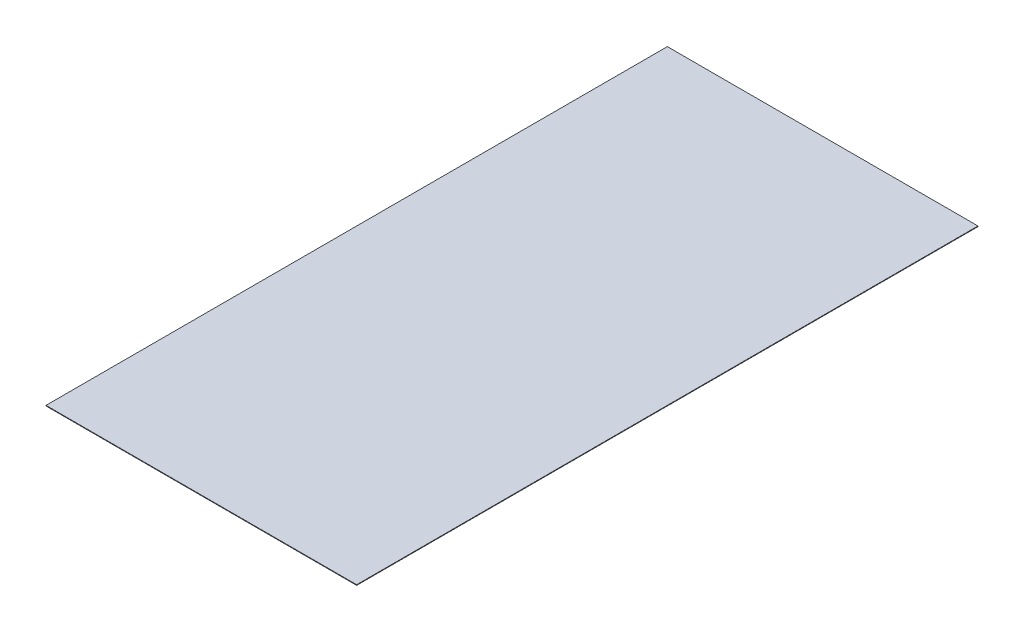
ISO-10303-21;
HEADER;
FILE_DESCRIPTION(('STEP AP214'),'2;1');
FILE_NAME('part.step','',(''),(''),'','','');
FILE_SCHEMA(('AUTOMOTIVE_DESIGN { 1 0 10303 214 1 1 1 1 }'));
ENDSEC;
DATA;
#1=APPLICATION_CONTEXT('core data for automotive mechanical design processes');
#2=APPLICATION_PROTOCOL_DEFINITION('international standard','automotive_design',2000,#1);
#3=PRODUCT_CONTEXT('',#1,'mechanical');
#4=PRODUCT('Part','Part','',(#3));
#5=PRODUCT_RELATED_PRODUCT_CATEGORY('part','',(#4));
#6=PRODUCT_DEFINITION_FORMATION('','',#4);
#7=PRODUCT_DEFINITION_CONTEXT('part definition',#1,'design');
#8=PRODUCT_DEFINITION('design','',#6,#7);
#9=PRODUCT_DEFINITION_SHAPE('','',#8);
#10=(LENGTH_UNIT() NAMED_UNIT(*) SI_UNIT(.MILLI.,.METRE.));
#11=(NAMED_UNIT(*) PLANE_ANGLE_UNIT() SI_UNIT($,.RADIAN.));
#12=(NAMED_UNIT(*) SI_UNIT($,.STERADIAN.) SOLID_ANGLE_UNIT());
#13=UNCERTAINTY_MEASURE_WITH_UNIT(LENGTH_MEASURE(1.E-05),#10,'distance_accuracy_value','');
#14=(GEOMETRIC_REPRESENTATION_CONTEXT(3) GLOBAL_UNCERTAINTY_ASSIGNED_CONTEXT((#13)) GLOBAL_UNIT_ASSIGNED_CONTEXT((#10,
#11,#12)) REPRESENTATION_CONTEXT('',''));
#15=CARTESIAN_POINT('',(0.,0.,0.));
#16=DIRECTION('',(0.,0.,1.));
#17=DIRECTION('',(1.,0.,0.));
#18=AXIS2_PLACEMENT_3D('',#15,#16,#17);
#19=CARTESIAN_POINT('',(609.6,2.3,1219.2));
#20=DIRECTION('',(-1.,0.,0.));
#21=DIRECTION('',(0.,0.,1.));
#22=AXIS2_PLACEMENT_3D('',#19,#20,#21);
#23=PLANE('',#22);
#24=DIRECTION('',(0.,0.,-1.));
#25=VECTOR('',#24,1.);
#26=CARTESIAN_POINT('',(609.6,0.,1219.2));
#27=LINE('',#26,#25);
#28=CARTESIAN_POINT('',(609.6,0.,1219.2));
#29=VERTEX_POINT('',#28);
#30=CARTESIAN_POINT('',(609.6,0.,-1219.2));
#31=VERTEX_POINT('',#30);
#32=EDGE_CURVE('E96',#29,#31,#27,.T.);
#33=ORIENTED_EDGE('',*,*,#32,.T.);
#34=DIRECTION('',(0.,-1.,0.));
#35=VECTOR('',#34,1.);
#36=CARTESIAN_POINT('',(609.6,2.3,-1219.2));
#37=LINE('',#36,#35);
#38=CARTESIAN_POINT('',(609.6,2.3,-1219.2));
#39=VERTEX_POINT('',#38);
#40=EDGE_CURVE('E11',#39,#31,#37,.T.);
#41=ORIENTED_EDGE('',*,*,#40,.F.);
#42=DIRECTION('',(0.,0.,-1.));
#43=VECTOR('',#42,1.);
#44=CARTESIAN_POINT('',(609.6,2.3,1219.2));
#45=LINE('',#44,#43);
#46=CARTESIAN_POINT('',(609.6,2.3,1219.2));
#47=VERTEX_POINT('',#46);
#48=EDGE_CURVE('E84',#47,#39,#45,.T.);
#49=ORIENTED_EDGE('',*,*,#48,.F.);
#50=DIRECTION('',(0.,-1.,0.));
#51=VECTOR('',#50,1.);
#52=CARTESIAN_POINT('',(609.6,2.3,1219.2));
#53=LINE('',#52,#51);
#54=EDGE_CURVE('E92',#47,#29,#53,.T.);
#55=ORIENTED_EDGE('',*,*,#54,.T.);
#56=EDGE_LOOP('',(#33,#41,#49,#55));
#57=FACE_BOUND('',#56,.T.);
#58=ADVANCED_FACE('F33',(#57),#23,.F.);
#59=CARTESIAN_POINT('',(-609.6,2.3,-1219.2));
#60=DIRECTION('',(0.,0.,1.));
#61=DIRECTION('',(1.,0.,0.));
#62=AXIS2_PLACEMENT_3D('',#59,#60,#61);
#63=PLANE('',#62);
#64=DIRECTION('',(-1.,0.,0.));
#65=VECTOR('',#64,1.);
#66=CARTESIAN_POINT('',(-609.6,0.,-1219.2));
#67=LINE('',#66,#65);
#68=CARTESIAN_POINT('',(-609.6,0.,-1219.2));
#69=VERTEX_POINT('',#68);
#70=EDGE_CURVE('E88',#31,#69,#67,.T.);
#71=ORIENTED_EDGE('',*,*,#70,.T.);
#72=DIRECTION('',(0.,-1.,0.));
#73=VECTOR('',#72,1.);
#74=CARTESIAN_POINT('',(-609.6,2.3,-1219.2));
#75=LINE('',#74,#73);
#76=CARTESIAN_POINT('',(-609.6,2.3,-1219.2));
#77=VERTEX_POINT('',#76);
#78=EDGE_CURVE('E41',#77,#69,#75,.T.);
#79=ORIENTED_EDGE('',*,*,#78,.F.);
#80=DIRECTION('',(-1.,0.,0.));
#81=VECTOR('',#80,1.);
#82=CARTESIAN_POINT('',(-609.6,2.3,-1219.2));
#83=LINE('',#82,#81);
#84=EDGE_CURVE('E79',#39,#77,#83,.T.);
#85=ORIENTED_EDGE('',*,*,#84,.F.);
#86=ORIENTED_EDGE('',*,*,#40,.T.);
#87=EDGE_LOOP('',(#71,#79,#85,#86));
#88=FACE_BOUND('',#87,.T.);
#89=ADVANCED_FACE('F87',(#88),#63,.F.);
#90=CARTESIAN_POINT('',(-609.6,2.3,1219.2));
#91=DIRECTION('',(1.,0.,0.));
#92=DIRECTION('',(0.,0.,-1.));
#93=AXIS2_PLACEMENT_3D('',#90,#91,#92);
#94=PLANE('',#93);
#95=DIRECTION('',(0.,0.,1.));
#96=VECTOR('',#95,1.);
#97=CARTESIAN_POINT('',(-609.6,0.,1219.2));
#98=LINE('',#97,#96);
#99=CARTESIAN_POINT('',(-609.6,0.,1219.2));
#100=VERTEX_POINT('',#99);
#101=EDGE_CURVE('E66',#69,#100,#98,.T.);
#102=ORIENTED_EDGE('',*,*,#101,.T.);
#103=DIRECTION('',(0.,-1.,0.));
#104=VECTOR('',#103,1.);
#105=CARTESIAN_POINT('',(-609.6,2.3,1219.2));
#106=LINE('',#105,#104);
#107=CARTESIAN_POINT('',(-609.6,2.3,1219.2));
#108=VERTEX_POINT('',#107);
#109=EDGE_CURVE('E89',#108,#100,#106,.T.);
#110=ORIENTED_EDGE('',*,*,#109,.F.);
#111=DIRECTION('',(0.,0.,1.));
#112=VECTOR('',#111,1.);
#113=CARTESIAN_POINT('',(-609.6,2.3,1219.2));
#114=LINE('',#113,#112);
#115=EDGE_CURVE('E82',#77,#108,#114,.T.);
#116=ORIENTED_EDGE('',*,*,#115,.F.);
#117=ORIENTED_EDGE('',*,*,#78,.T.);
#118=EDGE_LOOP('',(#102,#110,#116,#117));
#119=FACE_BOUND('',#118,.T.);
#120=ADVANCED_FACE('F90',(#119),#94,.F.);
#121=CARTESIAN_POINT('',(-609.6,2.3,1219.2));
#122=DIRECTION('',(0.,0.,-1.));
#123=DIRECTION('',(-1.,0.,0.));
#124=AXIS2_PLACEMENT_3D('',#121,#122,#123);
#125=PLANE('',#124);
#126=DIRECTION('',(1.,0.,0.));
#127=VECTOR('',#126,1.);
#128=CARTESIAN_POINT('',(-609.6,0.,1219.2));
#129=LINE('',#128,#127);
#130=EDGE_CURVE('E72',#100,#29,#129,.T.);
#131=ORIENTED_EDGE('',*,*,#130,.T.);
#132=ORIENTED_EDGE('',*,*,#54,.F.);
#133=DIRECTION('',(1.,0.,0.));
#134=VECTOR('',#133,1.);
#135=CARTESIAN_POINT('',(-609.6,2.3,1219.2));
#136=LINE('',#135,#134);
#137=EDGE_CURVE('E49',#108,#47,#136,.T.);
#138=ORIENTED_EDGE('',*,*,#137,.F.);
#139=ORIENTED_EDGE('',*,*,#109,.T.);
#140=EDGE_LOOP('',(#131,#132,#138,#139));
#141=FACE_BOUND('',#140,.T.);
#142=ADVANCED_FACE('F103',(#141),#125,.F.);
#143=CARTESIAN_POINT('',(0.,2.3,0.));
#144=DIRECTION('',(0.,-1.,0.));
#145=DIRECTION('',(0.,0.,-1.));
#146=AXIS2_PLACEMENT_3D('',#143,#144,#145);
#147=PLANE('',#146);
#148=ORIENTED_EDGE('',*,*,#48,.T.);
#149=ORIENTED_EDGE('',*,*,#84,.T.);
#150=ORIENTED_EDGE('',*,*,#115,.T.);
#151=ORIENTED_EDGE('',*,*,#137,.T.);
#152=EDGE_LOOP('',(#148,#149,#150,#151));
#153=FACE_BOUND('',#152,.T.);
#154=ADVANCED_FACE('F80',(#153),#147,.F.);
#155=CARTESIAN_POINT('',(0.,0.,0.));
#156=DIRECTION('',(0.,-1.,0.));
#157=DIRECTION('',(0.,0.,-1.));
#158=AXIS2_PLACEMENT_3D('',#155,#156,#157);
#159=PLANE('',#158);
#160=ORIENTED_EDGE('',*,*,#32,.F.);
#161=ORIENTED_EDGE('',*,*,#130,.F.);
#162=ORIENTED_EDGE('',*,*,#101,.F.);
#163=ORIENTED_EDGE('',*,*,#70,.F.);
#164=EDGE_LOOP('',(#160,#161,#162,#163));
#165=FACE_BOUND('',#164,.T.);
#166=ADVANCED_FACE('F106',(#165),#159,.T.);
#167=CLOSED_SHELL('',(#58,#89,#120,#142,#154,#166));
#168=MANIFOLD_SOLID_BREP('B2',#167);
#169=ADVANCED_BREP_SHAPE_REPRESENTATION('',(#18,#168),#14);
#170=SHAPE_DEFINITION_REPRESENTATION(#9,#169);
ENDSEC;
END-ISO-10303-21;
